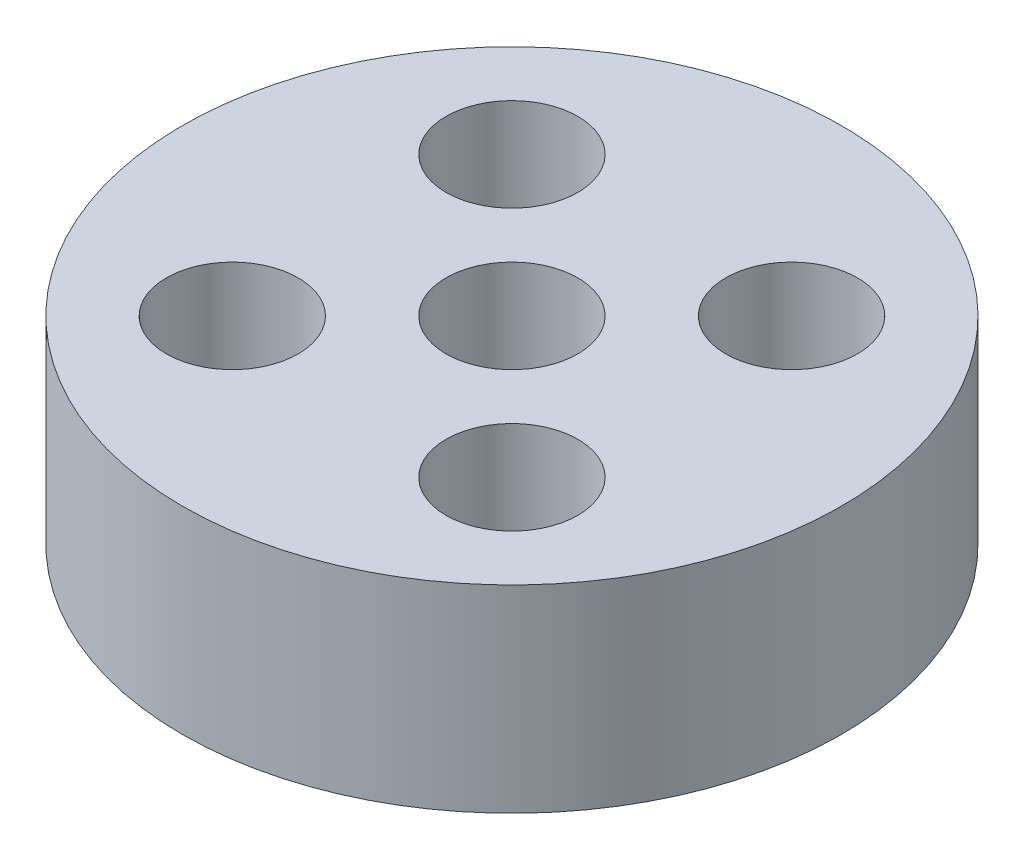
ISO-10303-21;
HEADER;
FILE_DESCRIPTION(('STEP AP214'),'2;1');
FILE_NAME('part.step','',(''),(''),'','','');
FILE_SCHEMA(('AUTOMOTIVE_DESIGN { 1 0 10303 214 1 1 1 1 }'));
ENDSEC;
DATA;
#1=APPLICATION_CONTEXT('core data for automotive mechanical design processes');
#2=APPLICATION_PROTOCOL_DEFINITION('international standard','automotive_design',2000,#1);
#3=PRODUCT_CONTEXT('',#1,'mechanical');
#4=PRODUCT('Part','Part','',(#3));
#5=PRODUCT_RELATED_PRODUCT_CATEGORY('part','',(#4));
#6=PRODUCT_DEFINITION_FORMATION('','',#4);
#7=PRODUCT_DEFINITION_CONTEXT('part definition',#1,'design');
#8=PRODUCT_DEFINITION('design','',#6,#7);
#9=PRODUCT_DEFINITION_SHAPE('','',#8);
#10=(LENGTH_UNIT() NAMED_UNIT(*) SI_UNIT(.MILLI.,.METRE.));
#11=(NAMED_UNIT(*) PLANE_ANGLE_UNIT() SI_UNIT($,.RADIAN.));
#12=(NAMED_UNIT(*) SI_UNIT($,.STERADIAN.) SOLID_ANGLE_UNIT());
#13=UNCERTAINTY_MEASURE_WITH_UNIT(LENGTH_MEASURE(1.E-05),#10,'distance_accuracy_value','');
#14=(GEOMETRIC_REPRESENTATION_CONTEXT(3) GLOBAL_UNCERTAINTY_ASSIGNED_CONTEXT((#13)) GLOBAL_UNIT_ASSIGNED_CONTEXT((#10,
#11,#12)) REPRESENTATION_CONTEXT('',''));
#15=CARTESIAN_POINT('',(0.,0.,0.));
#16=DIRECTION('',(0.,0.,1.));
#17=DIRECTION('',(1.,0.,0.));
#18=AXIS2_PLACEMENT_3D('',#15,#16,#17);
#19=CARTESIAN_POINT('',(0.,15.,0.));
#20=DIRECTION('',(0.,1.,0.));
#21=DIRECTION('',(0.,0.,1.));
#22=AXIS2_PLACEMENT_3D('',#19,#20,#21);
#23=PLANE('',#22);
#24=CARTESIAN_POINT('',(0.,15.,0.));
#25=DIRECTION('',(0.,1.,0.));
#26=DIRECTION('',(0.,0.,1.));
#27=AXIS2_PLACEMENT_3D('',#24,#25,#26);
#28=CIRCLE('',#27,5.);
#29=CARTESIAN_POINT('',(0.,15.,5.));
#30=VERTEX_POINT('',#29);
#31=EDGE_CURVE('E68',#30,#30,#28,.T.);
#32=ORIENTED_EDGE('',*,*,#31,.F.);
#33=EDGE_LOOP('',(#32));
#34=FACE_BOUND('',#33,.T.);
#35=CARTESIAN_POINT('',(-10.6066017177977,15.,10.6066017177987));
#36=DIRECTION('',(0.,1.,0.));
#37=DIRECTION('',(0.,0.,1.));
#38=AXIS2_PLACEMENT_3D('',#35,#36,#37);
#39=CIRCLE('',#38,5.00000000000044);
#40=CARTESIAN_POINT('',(-10.6066017177977,15.,15.6066017177992));
#41=VERTEX_POINT('',#40);
#42=EDGE_CURVE('E53',#41,#41,#39,.T.);
#43=ORIENTED_EDGE('',*,*,#42,.F.);
#44=EDGE_LOOP('',(#43));
#45=FACE_BOUND('',#44,.T.);
#46=CARTESIAN_POINT('',(10.6066017177983,15.,-10.6066017177982));
#47=DIRECTION('',(0.,1.,0.));
#48=DIRECTION('',(0.,0.,1.));
#49=AXIS2_PLACEMENT_3D('',#46,#47,#48);
#50=CIRCLE('',#49,5.);
#51=CARTESIAN_POINT('',(10.6066017177983,15.,-5.60660171779816));
#52=VERTEX_POINT('',#51);
#53=EDGE_CURVE('E42',#52,#52,#50,.T.);
#54=ORIENTED_EDGE('',*,*,#53,.F.);
#55=EDGE_LOOP('',(#54));
#56=FACE_BOUND('',#55,.T.);
#57=CARTESIAN_POINT('',(0.,15.,0.));
#58=DIRECTION('',(0.,1.,0.));
#59=DIRECTION('',(0.,0.,1.));
#60=AXIS2_PLACEMENT_3D('',#57,#58,#59);
#61=CIRCLE('',#60,25.);
#62=CARTESIAN_POINT('',(0.,15.,25.));
#63=VERTEX_POINT('',#62);
#64=EDGE_CURVE('E10',#63,#63,#61,.T.);
#65=ORIENTED_EDGE('',*,*,#64,.T.);
#66=EDGE_LOOP('',(#65));
#67=FACE_BOUND('',#66,.T.);
#68=CARTESIAN_POINT('',(10.6066017177981,15.,10.6066017177983));
#69=DIRECTION('',(0.,1.,0.));
#70=DIRECTION('',(0.,0.,1.));
#71=AXIS2_PLACEMENT_3D('',#68,#69,#70);
#72=CIRCLE('',#71,5.);
#73=CARTESIAN_POINT('',(10.6066017177981,15.,15.6066017177983));
#74=VERTEX_POINT('',#73);
#75=EDGE_CURVE('E47',#74,#74,#72,.T.);
#76=ORIENTED_EDGE('',*,*,#75,.F.);
#77=EDGE_LOOP('',(#76));
#78=FACE_BOUND('',#77,.T.);
#79=CARTESIAN_POINT('',(-10.606601717798,15.,-10.6066017177984));
#80=DIRECTION('',(0.,1.,0.));
#81=DIRECTION('',(0.,0.,1.));
#82=AXIS2_PLACEMENT_3D('',#79,#80,#81);
#83=CIRCLE('',#82,5.);
#84=CARTESIAN_POINT('',(-10.606601717798,15.,-5.60660171779838));
#85=VERTEX_POINT('',#84);
#86=EDGE_CURVE('E59',#85,#85,#83,.T.);
#87=ORIENTED_EDGE('',*,*,#86,.F.);
#88=EDGE_LOOP('',(#87));
#89=FACE_BOUND('',#88,.T.);
#90=ADVANCED_FACE('F31',(#34,#45,#56,#67,#78,#89),#23,.T.);
#91=CARTESIAN_POINT('',(0.,0.,0.));
#92=DIRECTION('',(0.,1.,0.));
#93=DIRECTION('',(0.,0.,1.));
#94=AXIS2_PLACEMENT_3D('',#91,#92,#93);
#95=PLANE('',#94);
#96=CARTESIAN_POINT('',(0.,0.,0.));
#97=DIRECTION('',(0.,1.,0.));
#98=DIRECTION('',(0.,0.,1.));
#99=AXIS2_PLACEMENT_3D('',#96,#97,#98);
#100=CIRCLE('',#99,5.);
#101=CARTESIAN_POINT('',(0.,0.,5.));
#102=VERTEX_POINT('',#101);
#103=EDGE_CURVE('E65',#102,#102,#100,.T.);
#104=ORIENTED_EDGE('',*,*,#103,.T.);
#105=EDGE_LOOP('',(#104));
#106=FACE_BOUND('',#105,.T.);
#107=CARTESIAN_POINT('',(0.,0.,0.));
#108=DIRECTION('',(0.,1.,0.));
#109=DIRECTION('',(0.,0.,1.));
#110=AXIS2_PLACEMENT_3D('',#107,#108,#109);
#111=CIRCLE('',#110,25.);
#112=CARTESIAN_POINT('',(0.,0.,25.));
#113=VERTEX_POINT('',#112);
#114=EDGE_CURVE('E35',#113,#113,#111,.T.);
#115=ORIENTED_EDGE('',*,*,#114,.F.);
#116=EDGE_LOOP('',(#115));
#117=FACE_BOUND('',#116,.T.);
#118=CARTESIAN_POINT('',(10.6066017177983,0.,-10.6066017177982));
#119=DIRECTION('',(0.,1.,0.));
#120=DIRECTION('',(0.,0.,1.));
#121=AXIS2_PLACEMENT_3D('',#118,#119,#120);
#122=CIRCLE('',#121,5.);
#123=CARTESIAN_POINT('',(10.6066017177983,0.,-5.60660171779816));
#124=VERTEX_POINT('',#123);
#125=EDGE_CURVE('E44',#124,#124,#122,.T.);
#126=ORIENTED_EDGE('',*,*,#125,.T.);
#127=EDGE_LOOP('',(#126));
#128=FACE_BOUND('',#127,.T.);
#129=CARTESIAN_POINT('',(10.6066017177981,0.,10.6066017177983));
#130=DIRECTION('',(0.,1.,0.));
#131=DIRECTION('',(0.,0.,1.));
#132=AXIS2_PLACEMENT_3D('',#129,#130,#131);
#133=CIRCLE('',#132,5.);
#134=CARTESIAN_POINT('',(10.6066017177981,0.,15.6066017177983));
#135=VERTEX_POINT('',#134);
#136=EDGE_CURVE('E50',#135,#135,#133,.T.);
#137=ORIENTED_EDGE('',*,*,#136,.T.);
#138=EDGE_LOOP('',(#137));
#139=FACE_BOUND('',#138,.T.);
#140=CARTESIAN_POINT('',(-10.6066017177977,0.,10.6066017177987));
#141=DIRECTION('',(0.,1.,0.));
#142=DIRECTION('',(0.,0.,1.));
#143=AXIS2_PLACEMENT_3D('',#140,#141,#142);
#144=CIRCLE('',#143,5.00000000000044);
#145=CARTESIAN_POINT('',(-10.6066017177977,0.,15.6066017177992));
#146=VERTEX_POINT('',#145);
#147=EDGE_CURVE('E56',#146,#146,#144,.T.);
#148=ORIENTED_EDGE('',*,*,#147,.T.);
#149=EDGE_LOOP('',(#148));
#150=FACE_BOUND('',#149,.T.);
#151=CARTESIAN_POINT('',(-10.606601717798,0.,-10.6066017177984));
#152=DIRECTION('',(0.,1.,0.));
#153=DIRECTION('',(0.,0.,1.));
#154=AXIS2_PLACEMENT_3D('',#151,#152,#153);
#155=CIRCLE('',#154,5.);
#156=CARTESIAN_POINT('',(-10.606601717798,0.,-5.60660171779838));
#157=VERTEX_POINT('',#156);
#158=EDGE_CURVE('E62',#157,#157,#155,.T.);
#159=ORIENTED_EDGE('',*,*,#158,.T.);
#160=EDGE_LOOP('',(#159));
#161=FACE_BOUND('',#160,.T.);
#162=ADVANCED_FACE('F74',(#106,#117,#128,#139,#150,#161),#95,.F.);
#163=CARTESIAN_POINT('',(0.,15.,0.));
#164=DIRECTION('',(0.,-1.,0.));
#165=DIRECTION('',(0.,0.,-1.));
#166=AXIS2_PLACEMENT_3D('',#163,#164,#165);
#167=CYLINDRICAL_SURFACE('',#166,25.);
#168=ORIENTED_EDGE('',*,*,#64,.F.);
#169=EDGE_LOOP('',(#168));
#170=FACE_BOUND('',#169,.T.);
#171=ORIENTED_EDGE('',*,*,#114,.T.);
#172=EDGE_LOOP('',(#171));
#173=FACE_BOUND('',#172,.T.);
#174=ADVANCED_FACE('F33',(#170,#173),#167,.T.);
#175=CARTESIAN_POINT('',(10.6066017177983,15.,-10.6066017177982));
#176=DIRECTION('',(0.,-1.,0.));
#177=DIRECTION('',(0.,0.,-1.));
#178=AXIS2_PLACEMENT_3D('',#175,#176,#177);
#179=CYLINDRICAL_SURFACE('',#178,5.);
#180=ORIENTED_EDGE('',*,*,#53,.T.);
#181=EDGE_LOOP('',(#180));
#182=FACE_BOUND('',#181,.T.);
#183=ORIENTED_EDGE('',*,*,#125,.F.);
#184=EDGE_LOOP('',(#183));
#185=FACE_BOUND('',#184,.T.);
#186=ADVANCED_FACE('F105',(#182,#185),#179,.F.);
#187=CARTESIAN_POINT('',(10.6066017177981,15.,10.6066017177983));
#188=DIRECTION('',(0.,-1.,0.));
#189=DIRECTION('',(0.,0.,-1.));
#190=AXIS2_PLACEMENT_3D('',#187,#188,#189);
#191=CYLINDRICAL_SURFACE('',#190,5.);
#192=ORIENTED_EDGE('',*,*,#75,.T.);
#193=EDGE_LOOP('',(#192));
#194=FACE_BOUND('',#193,.T.);
#195=ORIENTED_EDGE('',*,*,#136,.F.);
#196=EDGE_LOOP('',(#195));
#197=FACE_BOUND('',#196,.T.);
#198=ADVANCED_FACE('F110',(#194,#197),#191,.F.);
#199=CARTESIAN_POINT('',(-10.6066017177977,15.,10.6066017177987));
#200=DIRECTION('',(0.,-1.,0.));
#201=DIRECTION('',(0.,0.,-1.));
#202=AXIS2_PLACEMENT_3D('',#199,#200,#201);
#203=CYLINDRICAL_SURFACE('',#202,5.00000000000044);
#204=ORIENTED_EDGE('',*,*,#42,.T.);
#205=EDGE_LOOP('',(#204));
#206=FACE_BOUND('',#205,.T.);
#207=ORIENTED_EDGE('',*,*,#147,.F.);
#208=EDGE_LOOP('',(#207));
#209=FACE_BOUND('',#208,.T.);
#210=ADVANCED_FACE('F97',(#206,#209),#203,.F.);
#211=CARTESIAN_POINT('',(-10.606601717798,15.,-10.6066017177984));
#212=DIRECTION('',(0.,-1.,0.));
#213=DIRECTION('',(0.,0.,-1.));
#214=AXIS2_PLACEMENT_3D('',#211,#212,#213);
#215=CYLINDRICAL_SURFACE('',#214,5.);
#216=ORIENTED_EDGE('',*,*,#86,.T.);
#217=EDGE_LOOP('',(#216));
#218=FACE_BOUND('',#217,.T.);
#219=ORIENTED_EDGE('',*,*,#158,.F.);
#220=EDGE_LOOP('',(#219));
#221=FACE_BOUND('',#220,.T.);
#222=ADVANCED_FACE('F80',(#218,#221),#215,.F.);
#223=CARTESIAN_POINT('',(0.,0.,0.));
#224=DIRECTION('',(0.,1.,0.));
#225=DIRECTION('',(0.,0.,1.));
#226=AXIS2_PLACEMENT_3D('',#223,#224,#225);
#227=CYLINDRICAL_SURFACE('',#226,5.);
#228=ORIENTED_EDGE('',*,*,#103,.F.);
#229=EDGE_LOOP('',(#228));
#230=FACE_BOUND('',#229,.T.);
#231=ORIENTED_EDGE('',*,*,#31,.T.);
#232=EDGE_LOOP('',(#231));
#233=FACE_BOUND('',#232,.T.);
#234=ADVANCED_FACE('F77',(#230,#233),#227,.F.);
#235=CLOSED_SHELL('',(#90,#162,#174,#186,#198,#210,#222,#234));
#236=MANIFOLD_SOLID_BREP('B2',#235);
#237=ADVANCED_BREP_SHAPE_REPRESENTATION('',(#18,#236),#14);
#238=SHAPE_DEFINITION_REPRESENTATION(#9,#237);
ENDSEC;
END-ISO-10303-21;
